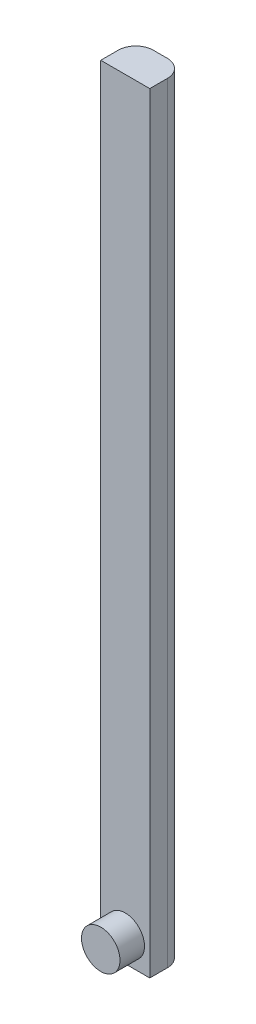
ISO-10303-21;
HEADER;
FILE_DESCRIPTION(('STEP AP214'),'2;1');
FILE_NAME('part.step','',(''),(''),'','','');
FILE_SCHEMA(('AUTOMOTIVE_DESIGN { 1 0 10303 214 1 1 1 1 }'));
ENDSEC;
DATA;
#1=APPLICATION_CONTEXT('core data for automotive mechanical design processes');
#2=APPLICATION_PROTOCOL_DEFINITION('international standard','automotive_design',2000,#1);
#3=PRODUCT_CONTEXT('',#1,'mechanical');
#4=PRODUCT('Part','Part','',(#3));
#5=PRODUCT_RELATED_PRODUCT_CATEGORY('part','',(#4));
#6=PRODUCT_DEFINITION_FORMATION('','',#4);
#7=PRODUCT_DEFINITION_CONTEXT('part definition',#1,'design');
#8=PRODUCT_DEFINITION('design','',#6,#7);
#9=PRODUCT_DEFINITION_SHAPE('','',#8);
#10=(LENGTH_UNIT() NAMED_UNIT(*) SI_UNIT(.MILLI.,.METRE.));
#11=(NAMED_UNIT(*) PLANE_ANGLE_UNIT() SI_UNIT($,.RADIAN.));
#12=(NAMED_UNIT(*) SI_UNIT($,.STERADIAN.) SOLID_ANGLE_UNIT());
#13=UNCERTAINTY_MEASURE_WITH_UNIT(LENGTH_MEASURE(1.E-05),#10,'distance_accuracy_value','');
#14=(GEOMETRIC_REPRESENTATION_CONTEXT(3) GLOBAL_UNCERTAINTY_ASSIGNED_CONTEXT((#13)) GLOBAL_UNIT_ASSIGNED_CONTEXT((#10,
#11,#12)) REPRESENTATION_CONTEXT('',''));
#15=CARTESIAN_POINT('',(0.,0.,0.));
#16=DIRECTION('',(0.,0.,1.));
#17=DIRECTION('',(1.,0.,0.));
#18=AXIS2_PLACEMENT_3D('',#15,#16,#17);
#19=CARTESIAN_POINT('',(0.,110.,5.));
#20=DIRECTION('',(1.,0.,0.));
#21=DIRECTION('',(0.,1.,0.));
#22=AXIS2_PLACEMENT_3D('',#19,#20,#21);
#23=PLANE('',#22);
#24=DIRECTION('',(0.,0.,-1.));
#25=VECTOR('',#24,1.);
#26=CARTESIAN_POINT('',(0.,110.,5.));
#27=LINE('',#26,#25);
#28=CARTESIAN_POINT('',(0.,110.,5.));
#29=VERTEX_POINT('',#28);
#30=CARTESIAN_POINT('',(0.,110.,2.5));
#31=VERTEX_POINT('',#30);
#32=EDGE_CURVE('E149',#29,#31,#27,.T.);
#33=ORIENTED_EDGE('',*,*,#32,.T.);
#34=DIRECTION('',(0.,-1.,0.));
#35=VECTOR('',#34,1.);
#36=CARTESIAN_POINT('',(0.,110.,2.5));
#37=LINE('',#36,#35);
#38=CARTESIAN_POINT('',(0.,0.,2.5));
#39=VERTEX_POINT('',#38);
#40=EDGE_CURVE('E11',#31,#39,#37,.T.);
#41=ORIENTED_EDGE('',*,*,#40,.T.);
#42=DIRECTION('',(0.,0.,-1.));
#43=VECTOR('',#42,1.);
#44=CARTESIAN_POINT('',(0.,0.,5.));
#45=LINE('',#44,#43);
#46=CARTESIAN_POINT('',(0.,0.,5.));
#47=VERTEX_POINT('',#46);
#48=EDGE_CURVE('E98',#47,#39,#45,.T.);
#49=ORIENTED_EDGE('',*,*,#48,.F.);
#50=DIRECTION('',(0.,-1.,0.));
#51=VECTOR('',#50,1.);
#52=CARTESIAN_POINT('',(0.,110.,5.));
#53=LINE('',#52,#51);
#54=EDGE_CURVE('E104',#29,#47,#53,.T.);
#55=ORIENTED_EDGE('',*,*,#54,.F.);
#56=EDGE_LOOP('',(#33,#41,#49,#55));
#57=FACE_BOUND('',#56,.T.);
#58=ADVANCED_FACE('F39',(#57),#23,.F.);
#59=CARTESIAN_POINT('',(0.,0.,5.));
#60=DIRECTION('',(0.,1.,0.));
#61=DIRECTION('',(0.,0.,1.));
#62=AXIS2_PLACEMENT_3D('',#59,#60,#61);
#63=PLANE('',#62);
#64=DIRECTION('',(1.,0.,0.));
#65=VECTOR('',#64,1.);
#66=CARTESIAN_POINT('',(0.,0.,0.));
#67=LINE('',#66,#65);
#68=CARTESIAN_POINT('',(2.5,0.,0.));
#69=VERTEX_POINT('',#68);
#70=CARTESIAN_POINT('',(4.5,0.,0.));
#71=VERTEX_POINT('',#70);
#72=EDGE_CURVE('E131',#69,#71,#67,.T.);
#73=ORIENTED_EDGE('',*,*,#72,.T.);
#74=CARTESIAN_POINT('',(4.5,0.,2.5));
#75=DIRECTION('',(0.,1.,0.));
#76=DIRECTION('',(0.,0.,1.));
#77=AXIS2_PLACEMENT_3D('',#74,#75,#76);
#78=CIRCLE('',#77,2.5);
#79=CARTESIAN_POINT('',(7.,0.,2.5));
#80=VERTEX_POINT('',#79);
#81=EDGE_CURVE('E47',#71,#80,#78,.F.);
#82=ORIENTED_EDGE('',*,*,#81,.T.);
#83=DIRECTION('',(0.,0.,-1.));
#84=VECTOR('',#83,1.);
#85=CARTESIAN_POINT('',(7.,0.,5.));
#86=LINE('',#85,#84);
#87=CARTESIAN_POINT('',(7.,0.,5.));
#88=VERTEX_POINT('',#87);
#89=EDGE_CURVE('E100',#88,#80,#86,.T.);
#90=ORIENTED_EDGE('',*,*,#89,.F.);
#91=DIRECTION('',(1.,0.,0.));
#92=VECTOR('',#91,1.);
#93=CARTESIAN_POINT('',(0.,0.,5.));
#94=LINE('',#93,#92);
#95=EDGE_CURVE('E94',#47,#88,#94,.T.);
#96=ORIENTED_EDGE('',*,*,#95,.F.);
#97=ORIENTED_EDGE('',*,*,#48,.T.);
#98=CARTESIAN_POINT('',(2.5,0.,2.5));
#99=DIRECTION('',(0.,1.,0.));
#100=DIRECTION('',(0.,0.,1.));
#101=AXIS2_PLACEMENT_3D('',#98,#99,#100);
#102=CIRCLE('',#101,2.5);
#103=EDGE_CURVE('E54',#39,#69,#102,.F.);
#104=ORIENTED_EDGE('',*,*,#103,.T.);
#105=EDGE_LOOP('',(#73,#82,#90,#96,#97,#104));
#106=FACE_BOUND('',#105,.T.);
#107=ADVANCED_FACE('F96',(#106),#63,.F.);
#108=CARTESIAN_POINT('',(7.,0.,5.));
#109=DIRECTION('',(-1.,0.,0.));
#110=DIRECTION('',(0.,0.,1.));
#111=AXIS2_PLACEMENT_3D('',#108,#109,#110);
#112=PLANE('',#111);
#113=ORIENTED_EDGE('',*,*,#89,.T.);
#114=DIRECTION('',(0.,1.,0.));
#115=VECTOR('',#114,1.);
#116=CARTESIAN_POINT('',(7.,0.,2.5));
#117=LINE('',#116,#115);
#118=CARTESIAN_POINT('',(7.,110.,2.5));
#119=VERTEX_POINT('',#118);
#120=EDGE_CURVE('E115',#80,#119,#117,.T.);
#121=ORIENTED_EDGE('',*,*,#120,.T.);
#122=DIRECTION('',(0.,0.,-1.));
#123=VECTOR('',#122,1.);
#124=CARTESIAN_POINT('',(7.,110.,5.));
#125=LINE('',#124,#123);
#126=CARTESIAN_POINT('',(7.,110.,5.));
#127=VERTEX_POINT('',#126);
#128=EDGE_CURVE('E120',#127,#119,#125,.T.);
#129=ORIENTED_EDGE('',*,*,#128,.F.);
#130=DIRECTION('',(0.,1.,0.));
#131=VECTOR('',#130,1.);
#132=CARTESIAN_POINT('',(7.,0.,5.));
#133=LINE('',#132,#131);
#134=EDGE_CURVE('E103',#88,#127,#133,.T.);
#135=ORIENTED_EDGE('',*,*,#134,.F.);
#136=EDGE_LOOP('',(#113,#121,#129,#135));
#137=FACE_BOUND('',#136,.T.);
#138=ADVANCED_FACE('F135',(#137),#112,.F.);
#139=CARTESIAN_POINT('',(7.,110.,5.));
#140=DIRECTION('',(0.,-1.,0.));
#141=DIRECTION('',(0.,0.,-1.));
#142=AXIS2_PLACEMENT_3D('',#139,#140,#141);
#143=PLANE('',#142);
#144=ORIENTED_EDGE('',*,*,#128,.T.);
#145=CARTESIAN_POINT('',(4.5,110.,2.5));
#146=DIRECTION('',(0.,-1.,0.));
#147=DIRECTION('',(0.,0.,-1.));
#148=AXIS2_PLACEMENT_3D('',#145,#146,#147);
#149=CIRCLE('',#148,2.5);
#150=CARTESIAN_POINT('',(4.5,110.,0.));
#151=VERTEX_POINT('',#150);
#152=EDGE_CURVE('E125',#119,#151,#149,.F.);
#153=ORIENTED_EDGE('',*,*,#152,.T.);
#154=DIRECTION('',(-1.,0.,0.));
#155=VECTOR('',#154,1.);
#156=CARTESIAN_POINT('',(7.,110.,0.));
#157=LINE('',#156,#155);
#158=CARTESIAN_POINT('',(2.5,110.,0.));
#159=VERTEX_POINT('',#158);
#160=EDGE_CURVE('E113',#151,#159,#157,.T.);
#161=ORIENTED_EDGE('',*,*,#160,.T.);
#162=CARTESIAN_POINT('',(2.5,110.,2.5));
#163=DIRECTION('',(0.,-1.,0.));
#164=DIRECTION('',(0.,0.,-1.));
#165=AXIS2_PLACEMENT_3D('',#162,#163,#164);
#166=CIRCLE('',#165,2.5);
#167=EDGE_CURVE('E118',#159,#31,#166,.F.);
#168=ORIENTED_EDGE('',*,*,#167,.T.);
#169=ORIENTED_EDGE('',*,*,#32,.F.);
#170=DIRECTION('',(-1.,0.,0.));
#171=VECTOR('',#170,1.);
#172=CARTESIAN_POINT('',(7.,110.,5.));
#173=LINE('',#172,#171);
#174=EDGE_CURVE('E109',#127,#29,#173,.T.);
#175=ORIENTED_EDGE('',*,*,#174,.F.);
#176=EDGE_LOOP('',(#144,#153,#161,#168,#169,#175));
#177=FACE_BOUND('',#176,.T.);
#178=ADVANCED_FACE('F141',(#177),#143,.F.);
#179=CARTESIAN_POINT('',(0.,0.,5.));
#180=DIRECTION('',(0.,0.,1.));
#181=DIRECTION('',(1.,0.,0.));
#182=AXIS2_PLACEMENT_3D('',#179,#180,#181);
#183=PLANE('',#182);
#184=CARTESIAN_POINT('',(3.5,3.5488995949251,5.));
#185=DIRECTION('',(0.,0.,1.));
#186=DIRECTION('',(1.,0.,0.));
#187=AXIS2_PLACEMENT_3D('',#184,#185,#186);
#188=CIRCLE('',#187,2.75);
#189=CARTESIAN_POINT('',(6.25,3.5488995949251,5.));
#190=VERTEX_POINT('',#189);
#191=EDGE_CURVE('E152',#190,#190,#188,.T.);
#192=ORIENTED_EDGE('',*,*,#191,.F.);
#193=EDGE_LOOP('',(#192));
#194=FACE_BOUND('',#193,.T.);
#195=ORIENTED_EDGE('',*,*,#54,.T.);
#196=ORIENTED_EDGE('',*,*,#95,.T.);
#197=ORIENTED_EDGE('',*,*,#134,.T.);
#198=ORIENTED_EDGE('',*,*,#174,.T.);
#199=EDGE_LOOP('',(#195,#196,#197,#198));
#200=FACE_BOUND('',#199,.T.);
#201=ADVANCED_FACE('F107',(#194,#200),#183,.T.);
#202=CARTESIAN_POINT('',(0.,0.,0.));
#203=DIRECTION('',(0.,0.,1.));
#204=DIRECTION('',(1.,0.,0.));
#205=AXIS2_PLACEMENT_3D('',#202,#203,#204);
#206=PLANE('',#205);
#207=ORIENTED_EDGE('',*,*,#160,.F.);
#208=DIRECTION('',(0.,1.,0.));
#209=VECTOR('',#208,1.);
#210=CARTESIAN_POINT('',(4.5,0.,0.));
#211=LINE('',#210,#209);
#212=EDGE_CURVE('E61',#151,#71,#211,.F.);
#213=ORIENTED_EDGE('',*,*,#212,.T.);
#214=ORIENTED_EDGE('',*,*,#72,.F.);
#215=DIRECTION('',(0.,-1.,0.));
#216=VECTOR('',#215,1.);
#217=CARTESIAN_POINT('',(2.5,0.,0.));
#218=LINE('',#217,#216);
#219=EDGE_CURVE('E127',#69,#159,#218,.F.);
#220=ORIENTED_EDGE('',*,*,#219,.T.);
#221=EDGE_LOOP('',(#207,#213,#214,#220));
#222=FACE_BOUND('',#221,.T.);
#223=ADVANCED_FACE('F143',(#222),#206,.F.);
#224=CARTESIAN_POINT('',(4.5,0.,2.5));
#225=DIRECTION('',(0.,1.,0.));
#226=DIRECTION('',(0.,0.,1.));
#227=AXIS2_PLACEMENT_3D('',#224,#225,#226);
#228=CYLINDRICAL_SURFACE('',#227,2.5);
#229=ORIENTED_EDGE('',*,*,#81,.F.);
#230=ORIENTED_EDGE('',*,*,#212,.F.);
#231=ORIENTED_EDGE('',*,*,#152,.F.);
#232=ORIENTED_EDGE('',*,*,#120,.F.);
#233=EDGE_LOOP('',(#229,#230,#231,#232));
#234=FACE_BOUND('',#233,.T.);
#235=ADVANCED_FACE('F138',(#234),#228,.T.);
#236=CARTESIAN_POINT('',(2.5,110.,2.5));
#237=DIRECTION('',(0.,-1.,0.));
#238=DIRECTION('',(1.,0.,0.));
#239=AXIS2_PLACEMENT_3D('',#236,#237,#238);
#240=CYLINDRICAL_SURFACE('',#239,2.5);
#241=ORIENTED_EDGE('',*,*,#167,.F.);
#242=ORIENTED_EDGE('',*,*,#219,.F.);
#243=ORIENTED_EDGE('',*,*,#103,.F.);
#244=ORIENTED_EDGE('',*,*,#40,.F.);
#245=EDGE_LOOP('',(#241,#242,#243,#244));
#246=FACE_BOUND('',#245,.T.);
#247=ADVANCED_FACE('F41',(#246),#240,.T.);
#248=CARTESIAN_POINT('',(3.5,3.5488995949251,8.5));
#249=DIRECTION('',(0.,0.,-1.));
#250=DIRECTION('',(-1.,0.,0.));
#251=AXIS2_PLACEMENT_3D('',#248,#249,#250);
#252=CYLINDRICAL_SURFACE('',#251,2.75);
#253=CARTESIAN_POINT('',(3.5,3.5488995949251,8.5));
#254=DIRECTION('',(0.,0.,1.));
#255=DIRECTION('',(1.,0.,0.));
#256=AXIS2_PLACEMENT_3D('',#253,#254,#255);
#257=CIRCLE('',#256,2.75);
#258=CARTESIAN_POINT('',(6.25,3.5488995949251,8.5));
#259=VERTEX_POINT('',#258);
#260=EDGE_CURVE('E145',#259,#259,#257,.T.);
#261=ORIENTED_EDGE('',*,*,#260,.F.);
#262=EDGE_LOOP('',(#261));
#263=FACE_BOUND('',#262,.T.);
#264=ORIENTED_EDGE('',*,*,#191,.T.);
#265=EDGE_LOOP('',(#264));
#266=FACE_BOUND('',#265,.T.);
#267=ADVANCED_FACE('F160',(#263,#266),#252,.T.);
#268=CARTESIAN_POINT('',(3.5,3.5488995949251,8.5));
#269=DIRECTION('',(0.,0.,1.));
#270=DIRECTION('',(1.,0.,0.));
#271=AXIS2_PLACEMENT_3D('',#268,#269,#270);
#272=PLANE('',#271);
#273=ORIENTED_EDGE('',*,*,#260,.T.);
#274=EDGE_LOOP('',(#273));
#275=FACE_BOUND('',#274,.T.);
#276=ADVANCED_FACE('F158',(#275),#272,.T.);
#277=CLOSED_SHELL('',(#58,#107,#138,#178,#201,#223,#235,#247,#267,#276));
#278=MANIFOLD_SOLID_BREP('B2',#277);
#279=ADVANCED_BREP_SHAPE_REPRESENTATION('',(#18,#278),#14);
#280=SHAPE_DEFINITION_REPRESENTATION(#9,#279);
ENDSEC;
END-ISO-10303-21;
